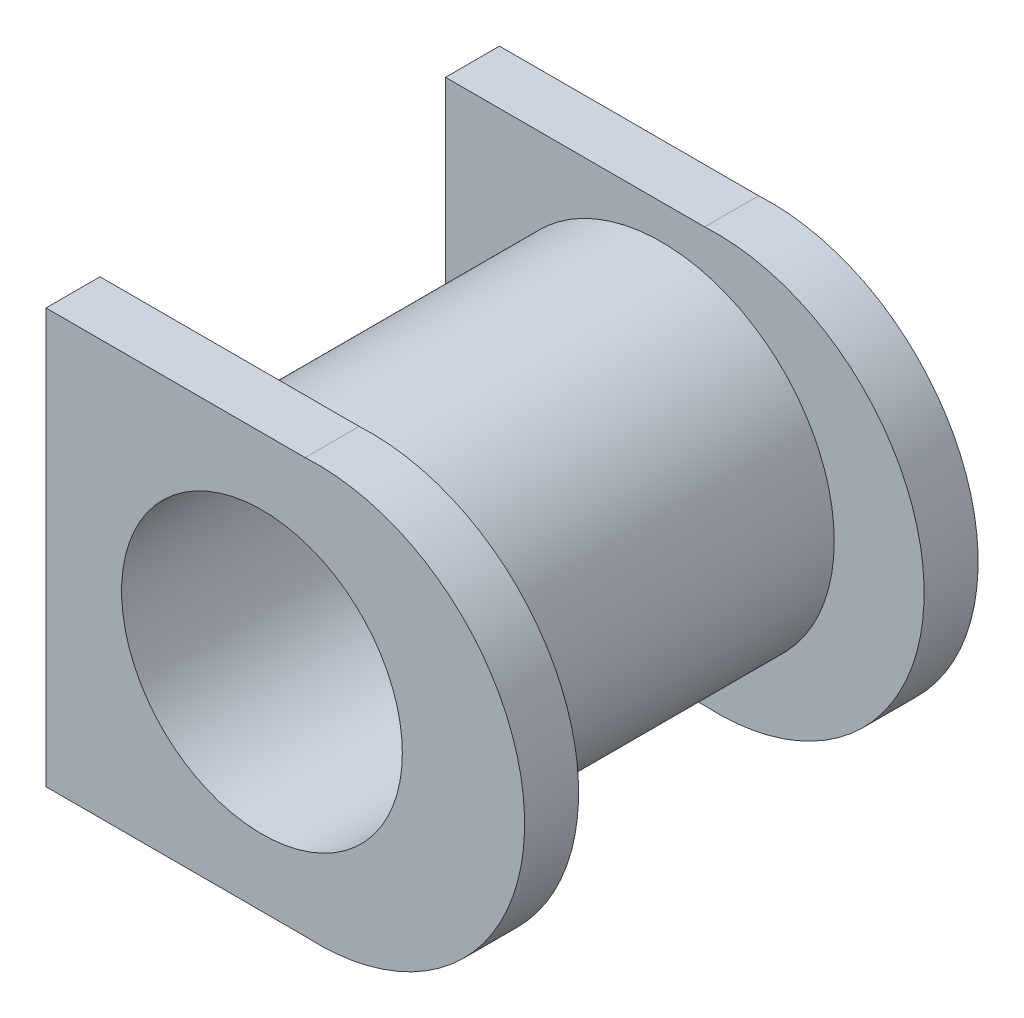
ISO-10303-21;
HEADER;
FILE_DESCRIPTION(('STEP AP214'),'2;1');
FILE_NAME('part.step','',(''),(''),'','','');
FILE_SCHEMA(('AUTOMOTIVE_DESIGN { 1 0 10303 214 1 1 1 1 }'));
ENDSEC;
DATA;
#1=APPLICATION_CONTEXT('core data for automotive mechanical design processes');
#2=APPLICATION_PROTOCOL_DEFINITION('international standard','automotive_design',2000,#1);
#3=PRODUCT_CONTEXT('',#1,'mechanical');
#4=PRODUCT('Part','Part','',(#3));
#5=PRODUCT_RELATED_PRODUCT_CATEGORY('part','',(#4));
#6=PRODUCT_DEFINITION_FORMATION('','',#4);
#7=PRODUCT_DEFINITION_CONTEXT('part definition',#1,'design');
#8=PRODUCT_DEFINITION('design','',#6,#7);
#9=PRODUCT_DEFINITION_SHAPE('','',#8);
#10=(LENGTH_UNIT() NAMED_UNIT(*) SI_UNIT(.MILLI.,.METRE.));
#11=(NAMED_UNIT(*) PLANE_ANGLE_UNIT() SI_UNIT($,.RADIAN.));
#12=(NAMED_UNIT(*) SI_UNIT($,.STERADIAN.) SOLID_ANGLE_UNIT());
#13=UNCERTAINTY_MEASURE_WITH_UNIT(LENGTH_MEASURE(1.E-05),#10,'distance_accuracy_value','');
#14=(GEOMETRIC_REPRESENTATION_CONTEXT(3) GLOBAL_UNCERTAINTY_ASSIGNED_CONTEXT((#13)) GLOBAL_UNIT_ASSIGNED_CONTEXT((#10,
#11,#12)) REPRESENTATION_CONTEXT('',''));
#15=CARTESIAN_POINT('',(0.,0.,0.));
#16=DIRECTION('',(0.,0.,1.));
#17=DIRECTION('',(1.,0.,0.));
#18=AXIS2_PLACEMENT_3D('',#15,#16,#17);
#19=CARTESIAN_POINT('',(32.7360823721547,0.,12.5));
#20=DIRECTION('',(0.,0.,-1.));
#21=DIRECTION('',(-1.,0.,0.));
#22=AXIS2_PLACEMENT_3D('',#19,#20,#21);
#23=CYLINDRICAL_SURFACE('',#22,48.0779174543492);
#24=CARTESIAN_POINT('',(32.7360823721547,0.,0.));
#25=DIRECTION('',(0.,0.,1.));
#26=DIRECTION('',(1.,0.,0.));
#27=AXIS2_PLACEMENT_3D('',#24,#25,#26);
#28=CIRCLE('',#27,48.0779174543492);
#29=CARTESIAN_POINT('',(30.,-48.,0.));
#30=VERTEX_POINT('',#29);
#31=CARTESIAN_POINT('',(30.,48.,0.));
#32=VERTEX_POINT('',#31);
#33=EDGE_CURVE('E149',#30,#32,#28,.T.);
#34=ORIENTED_EDGE('',*,*,#33,.T.);
#35=DIRECTION('',(0.,0.,-1.));
#36=VECTOR('',#35,1.);
#37=CARTESIAN_POINT('',(30.,48.,12.5));
#38=LINE('',#37,#36);
#39=CARTESIAN_POINT('',(30.,48.,12.5));
#40=VERTEX_POINT('',#39);
#41=EDGE_CURVE('E42',#40,#32,#38,.T.);
#42=ORIENTED_EDGE('',*,*,#41,.F.);
#43=CARTESIAN_POINT('',(32.7360823721547,0.,12.5));
#44=DIRECTION('',(0.,0.,1.));
#45=DIRECTION('',(1.,0.,0.));
#46=AXIS2_PLACEMENT_3D('',#43,#44,#45);
#47=CIRCLE('',#46,48.0779174543492);
#48=CARTESIAN_POINT('',(30.,-48.,12.5));
#49=VERTEX_POINT('',#48);
#50=EDGE_CURVE('E155',#49,#40,#47,.T.);
#51=ORIENTED_EDGE('',*,*,#50,.F.);
#52=DIRECTION('',(0.,0.,-1.));
#53=VECTOR('',#52,1.);
#54=CARTESIAN_POINT('',(30.,-48.,12.5));
#55=LINE('',#54,#53);
#56=EDGE_CURVE('E165',#49,#30,#55,.T.);
#57=ORIENTED_EDGE('',*,*,#56,.T.);
#58=EDGE_LOOP('',(#34,#42,#51,#57));
#59=FACE_BOUND('',#58,.T.);
#60=ADVANCED_FACE('F39',(#59),#23,.T.);
#61=CARTESIAN_POINT('',(-30.,48.,12.5));
#62=DIRECTION('',(0.,-1.,0.));
#63=DIRECTION('',(0.,0.,-1.));
#64=AXIS2_PLACEMENT_3D('',#61,#62,#63);
#65=PLANE('',#64);
#66=DIRECTION('',(-1.,0.,0.));
#67=VECTOR('',#66,1.);
#68=CARTESIAN_POINT('',(-30.,48.,0.));
#69=LINE('',#68,#67);
#70=CARTESIAN_POINT('',(-30.,48.,0.));
#71=VERTEX_POINT('',#70);
#72=EDGE_CURVE('E169',#32,#71,#69,.T.);
#73=ORIENTED_EDGE('',*,*,#72,.T.);
#74=DIRECTION('',(0.,0.,-1.));
#75=VECTOR('',#74,1.);
#76=CARTESIAN_POINT('',(-30.,48.,12.5));
#77=LINE('',#76,#75);
#78=CARTESIAN_POINT('',(-30.,48.,12.5));
#79=VERTEX_POINT('',#78);
#80=EDGE_CURVE('E180',#79,#71,#77,.T.);
#81=ORIENTED_EDGE('',*,*,#80,.F.);
#82=DIRECTION('',(-1.,0.,0.));
#83=VECTOR('',#82,1.);
#84=CARTESIAN_POINT('',(-30.,48.,12.5));
#85=LINE('',#84,#83);
#86=EDGE_CURVE('E89',#40,#79,#85,.T.);
#87=ORIENTED_EDGE('',*,*,#86,.F.);
#88=ORIENTED_EDGE('',*,*,#41,.T.);
#89=EDGE_LOOP('',(#73,#81,#87,#88));
#90=FACE_BOUND('',#89,.T.);
#91=ADVANCED_FACE('F185',(#90),#65,.F.);
#92=CARTESIAN_POINT('',(-30.,-48.,12.5));
#93=DIRECTION('',(1.,0.,0.));
#94=DIRECTION('',(0.,0.,-1.));
#95=AXIS2_PLACEMENT_3D('',#92,#93,#94);
#96=PLANE('',#95);
#97=DIRECTION('',(0.,-1.,0.));
#98=VECTOR('',#97,1.);
#99=CARTESIAN_POINT('',(-30.,-48.,0.));
#100=LINE('',#99,#98);
#101=CARTESIAN_POINT('',(-30.,-48.,0.));
#102=VERTEX_POINT('',#101);
#103=EDGE_CURVE('E75',#71,#102,#100,.T.);
#104=ORIENTED_EDGE('',*,*,#103,.T.);
#105=DIRECTION('',(0.,0.,-1.));
#106=VECTOR('',#105,1.);
#107=CARTESIAN_POINT('',(-30.,-48.,12.5));
#108=LINE('',#107,#106);
#109=CARTESIAN_POINT('',(-30.,-48.,12.5));
#110=VERTEX_POINT('',#109);
#111=EDGE_CURVE('E178',#110,#102,#108,.T.);
#112=ORIENTED_EDGE('',*,*,#111,.F.);
#113=DIRECTION('',(0.,-1.,0.));
#114=VECTOR('',#113,1.);
#115=CARTESIAN_POINT('',(-30.,-48.,12.5));
#116=LINE('',#115,#114);
#117=EDGE_CURVE('E160',#79,#110,#116,.T.);
#118=ORIENTED_EDGE('',*,*,#117,.F.);
#119=ORIENTED_EDGE('',*,*,#80,.T.);
#120=EDGE_LOOP('',(#104,#112,#118,#119));
#121=FACE_BOUND('',#120,.T.);
#122=ADVANCED_FACE('F211',(#121),#96,.F.);
#123=CARTESIAN_POINT('',(-30.,-48.,12.5));
#124=DIRECTION('',(0.,1.,0.));
#125=DIRECTION('',(0.,0.,1.));
#126=AXIS2_PLACEMENT_3D('',#123,#124,#125);
#127=PLANE('',#126);
#128=DIRECTION('',(1.,0.,0.));
#129=VECTOR('',#128,1.);
#130=CARTESIAN_POINT('',(-30.,-48.,0.));
#131=LINE('',#130,#129);
#132=EDGE_CURVE('E81',#102,#30,#131,.T.);
#133=ORIENTED_EDGE('',*,*,#132,.T.);
#134=ORIENTED_EDGE('',*,*,#56,.F.);
#135=DIRECTION('',(1.,0.,0.));
#136=VECTOR('',#135,1.);
#137=CARTESIAN_POINT('',(-30.,-48.,12.5));
#138=LINE('',#137,#136);
#139=EDGE_CURVE('E57',#110,#49,#138,.T.);
#140=ORIENTED_EDGE('',*,*,#139,.F.);
#141=ORIENTED_EDGE('',*,*,#111,.T.);
#142=EDGE_LOOP('',(#133,#134,#140,#141));
#143=FACE_BOUND('',#142,.T.);
#144=ADVANCED_FACE('F202',(#143),#127,.F.);
#145=CARTESIAN_POINT('',(32.7360823721547,0.,12.5));
#146=DIRECTION('',(0.,0.,1.));
#147=DIRECTION('',(1.,0.,0.));
#148=AXIS2_PLACEMENT_3D('',#145,#146,#147);
#149=PLANE('',#148);
#150=CARTESIAN_POINT('',(20.,0.,12.5));
#151=DIRECTION('',(0.,0.,1.));
#152=DIRECTION('',(1.,0.,0.));
#153=AXIS2_PLACEMENT_3D('',#150,#151,#152);
#154=CIRCLE('',#153,40.);
#155=CARTESIAN_POINT('',(60.,0.,12.5));
#156=VERTEX_POINT('',#155);
#157=EDGE_CURVE('E11',#156,#156,#154,.T.);
#158=ORIENTED_EDGE('',*,*,#157,.F.);
#159=EDGE_LOOP('',(#158));
#160=FACE_BOUND('',#159,.T.);
#161=ORIENTED_EDGE('',*,*,#50,.T.);
#162=ORIENTED_EDGE('',*,*,#86,.T.);
#163=ORIENTED_EDGE('',*,*,#117,.T.);
#164=ORIENTED_EDGE('',*,*,#139,.T.);
#165=EDGE_LOOP('',(#161,#162,#163,#164));
#166=FACE_BOUND('',#165,.T.);
#167=ADVANCED_FACE('F193',(#160,#166),#149,.T.);
#168=CARTESIAN_POINT('',(32.7360823721547,0.,0.));
#169=DIRECTION('',(0.,0.,1.));
#170=DIRECTION('',(1.,0.,0.));
#171=AXIS2_PLACEMENT_3D('',#168,#169,#170);
#172=PLANE('',#171);
#173=CARTESIAN_POINT('',(20.,0.,0.));
#174=DIRECTION('',(0.,0.,1.));
#175=DIRECTION('',(1.,0.,0.));
#176=AXIS2_PLACEMENT_3D('',#173,#174,#175);
#177=CIRCLE('',#176,32.5);
#178=CARTESIAN_POINT('',(52.5,0.,0.));
#179=VERTEX_POINT('',#178);
#180=EDGE_CURVE('E306',#179,#179,#177,.T.);
#181=ORIENTED_EDGE('',*,*,#180,.T.);
#182=EDGE_LOOP('',(#181));
#183=FACE_BOUND('',#182,.T.);
#184=ORIENTED_EDGE('',*,*,#33,.F.);
#185=ORIENTED_EDGE('',*,*,#132,.F.);
#186=ORIENTED_EDGE('',*,*,#103,.F.);
#187=ORIENTED_EDGE('',*,*,#72,.F.);
#188=EDGE_LOOP('',(#184,#185,#186,#187));
#189=FACE_BOUND('',#188,.T.);
#190=ADVANCED_FACE('F190',(#183,#189),#172,.F.);
#191=CARTESIAN_POINT('',(20.,0.,92.5));
#192=DIRECTION('',(0.,0.,-1.));
#193=DIRECTION('',(-1.,0.,0.));
#194=AXIS2_PLACEMENT_3D('',#191,#192,#193);
#195=CYLINDRICAL_SURFACE('',#194,40.);
#196=CARTESIAN_POINT('',(20.,0.,92.5));
#197=DIRECTION('',(0.,0.,1.));
#198=DIRECTION('',(1.,0.,0.));
#199=AXIS2_PLACEMENT_3D('',#196,#197,#198);
#200=CIRCLE('',#199,40.);
#201=CARTESIAN_POINT('',(60.,0.,92.5));
#202=VERTEX_POINT('',#201);
#203=EDGE_CURVE('E144',#202,#202,#200,.T.);
#204=ORIENTED_EDGE('',*,*,#203,.F.);
#205=EDGE_LOOP('',(#204));
#206=FACE_BOUND('',#205,.T.);
#207=ORIENTED_EDGE('',*,*,#157,.T.);
#208=EDGE_LOOP('',(#207));
#209=FACE_BOUND('',#208,.T.);
#210=ADVANCED_FACE('F192',(#206,#209),#195,.T.);
#211=CARTESIAN_POINT('',(-30.,48.,105.));
#212=DIRECTION('',(0.,-1.,0.));
#213=DIRECTION('',(0.,0.,-1.));
#214=AXIS2_PLACEMENT_3D('',#211,#212,#213);
#215=PLANE('',#214);
#216=DIRECTION('',(-1.,0.,0.));
#217=VECTOR('',#216,1.);
#218=CARTESIAN_POINT('',(-30.,48.,92.5));
#219=LINE('',#218,#217);
#220=CARTESIAN_POINT('',(30.,48.,92.5));
#221=VERTEX_POINT('',#220);
#222=CARTESIAN_POINT('',(-30.,48.,92.5));
#223=VERTEX_POINT('',#222);
#224=EDGE_CURVE('E142',#221,#223,#219,.T.);
#225=ORIENTED_EDGE('',*,*,#224,.T.);
#226=DIRECTION('',(0.,0.,-1.));
#227=VECTOR('',#226,1.);
#228=CARTESIAN_POINT('',(-30.,48.,105.));
#229=LINE('',#228,#227);
#230=CARTESIAN_POINT('',(-30.,48.,105.));
#231=VERTEX_POINT('',#230);
#232=EDGE_CURVE('E120',#231,#223,#229,.T.);
#233=ORIENTED_EDGE('',*,*,#232,.F.);
#234=DIRECTION('',(-1.,0.,0.));
#235=VECTOR('',#234,1.);
#236=CARTESIAN_POINT('',(-30.,48.,105.));
#237=LINE('',#236,#235);
#238=CARTESIAN_POINT('',(30.,48.,105.));
#239=VERTEX_POINT('',#238);
#240=EDGE_CURVE('E128',#239,#231,#237,.T.);
#241=ORIENTED_EDGE('',*,*,#240,.F.);
#242=DIRECTION('',(0.,0.,-1.));
#243=VECTOR('',#242,1.);
#244=CARTESIAN_POINT('',(30.,48.,105.));
#245=LINE('',#244,#243);
#246=EDGE_CURVE('E319',#239,#221,#245,.T.);
#247=ORIENTED_EDGE('',*,*,#246,.T.);
#248=EDGE_LOOP('',(#225,#233,#241,#247));
#249=FACE_BOUND('',#248,.T.);
#250=ADVANCED_FACE('F140',(#249),#215,.F.);
#251=CARTESIAN_POINT('',(-30.,48.,105.));
#252=DIRECTION('',(1.,0.,0.));
#253=DIRECTION('',(0.,0.,-1.));
#254=AXIS2_PLACEMENT_3D('',#251,#252,#253);
#255=PLANE('',#254);
#256=DIRECTION('',(0.,-1.,0.));
#257=VECTOR('',#256,1.);
#258=CARTESIAN_POINT('',(-30.,48.,92.5));
#259=LINE('',#258,#257);
#260=CARTESIAN_POINT('',(-30.,-48.,92.5));
#261=VERTEX_POINT('',#260);
#262=EDGE_CURVE('E322',#223,#261,#259,.T.);
#263=ORIENTED_EDGE('',*,*,#262,.T.);
#264=DIRECTION('',(0.,0.,-1.));
#265=VECTOR('',#264,1.);
#266=CARTESIAN_POINT('',(-30.,-48.,105.));
#267=LINE('',#266,#265);
#268=CARTESIAN_POINT('',(-30.,-48.,105.));
#269=VERTEX_POINT('',#268);
#270=EDGE_CURVE('E123',#269,#261,#267,.T.);
#271=ORIENTED_EDGE('',*,*,#270,.F.);
#272=DIRECTION('',(0.,-1.,0.));
#273=VECTOR('',#272,1.);
#274=CARTESIAN_POINT('',(-30.,48.,105.));
#275=LINE('',#274,#273);
#276=EDGE_CURVE('E116',#231,#269,#275,.T.);
#277=ORIENTED_EDGE('',*,*,#276,.F.);
#278=ORIENTED_EDGE('',*,*,#232,.T.);
#279=EDGE_LOOP('',(#263,#271,#277,#278));
#280=FACE_BOUND('',#279,.T.);
#281=ADVANCED_FACE('F118',(#280),#255,.F.);
#282=CARTESIAN_POINT('',(-30.,-48.,105.));
#283=DIRECTION('',(0.,1.,0.));
#284=DIRECTION('',(0.,0.,1.));
#285=AXIS2_PLACEMENT_3D('',#282,#283,#284);
#286=PLANE('',#285);
#287=DIRECTION('',(1.,0.,0.));
#288=VECTOR('',#287,1.);
#289=CARTESIAN_POINT('',(-30.,-48.,92.5));
#290=LINE('',#289,#288);
#291=CARTESIAN_POINT('',(30.,-48.,92.5));
#292=VERTEX_POINT('',#291);
#293=EDGE_CURVE('E325',#261,#292,#290,.T.);
#294=ORIENTED_EDGE('',*,*,#293,.T.);
#295=DIRECTION('',(0.,0.,-1.));
#296=VECTOR('',#295,1.);
#297=CARTESIAN_POINT('',(30.,-48.,105.));
#298=LINE('',#297,#296);
#299=CARTESIAN_POINT('',(30.,-48.,105.));
#300=VERTEX_POINT('',#299);
#301=EDGE_CURVE('E151',#300,#292,#298,.T.);
#302=ORIENTED_EDGE('',*,*,#301,.F.);
#303=DIRECTION('',(1.,0.,0.));
#304=VECTOR('',#303,1.);
#305=CARTESIAN_POINT('',(-30.,-48.,105.));
#306=LINE('',#305,#304);
#307=EDGE_CURVE('E127',#269,#300,#306,.T.);
#308=ORIENTED_EDGE('',*,*,#307,.F.);
#309=ORIENTED_EDGE('',*,*,#270,.T.);
#310=EDGE_LOOP('',(#294,#302,#308,#309));
#311=FACE_BOUND('',#310,.T.);
#312=ADVANCED_FACE('F249',(#311),#286,.F.);
#313=CARTESIAN_POINT('',(32.7360823721547,0.,105.));
#314=DIRECTION('',(0.,0.,-1.));
#315=DIRECTION('',(-1.,0.,0.));
#316=AXIS2_PLACEMENT_3D('',#313,#314,#315);
#317=CYLINDRICAL_SURFACE('',#316,48.0779174543492);
#318=CARTESIAN_POINT('',(32.7360823721547,0.,92.5));
#319=DIRECTION('',(0.,0.,1.));
#320=DIRECTION('',(-1.,0.,0.));
#321=AXIS2_PLACEMENT_3D('',#318,#319,#320);
#322=CIRCLE('',#321,48.0779174543492);
#323=EDGE_CURVE('E138',#292,#221,#322,.T.);
#324=ORIENTED_EDGE('',*,*,#323,.T.);
#325=ORIENTED_EDGE('',*,*,#246,.F.);
#326=CARTESIAN_POINT('',(32.7360823721547,0.,105.));
#327=DIRECTION('',(0.,0.,1.));
#328=DIRECTION('',(-1.,0.,0.));
#329=AXIS2_PLACEMENT_3D('',#326,#327,#328);
#330=CIRCLE('',#329,48.0779174543492);
#331=EDGE_CURVE('E133',#300,#239,#330,.T.);
#332=ORIENTED_EDGE('',*,*,#331,.F.);
#333=ORIENTED_EDGE('',*,*,#301,.T.);
#334=EDGE_LOOP('',(#324,#325,#332,#333));
#335=FACE_BOUND('',#334,.T.);
#336=ADVANCED_FACE('F258',(#335),#317,.T.);
#337=CARTESIAN_POINT('',(32.7360823721547,0.,105.));
#338=DIRECTION('',(0.,0.,-1.));
#339=DIRECTION('',(-1.,0.,0.));
#340=AXIS2_PLACEMENT_3D('',#337,#338,#339);
#341=PLANE('',#340);
#342=CARTESIAN_POINT('',(20.,0.,105.));
#343=DIRECTION('',(0.,0.,1.));
#344=DIRECTION('',(1.,0.,0.));
#345=AXIS2_PLACEMENT_3D('',#342,#343,#344);
#346=CIRCLE('',#345,32.5);
#347=CARTESIAN_POINT('',(52.5,0.,105.));
#348=VERTEX_POINT('',#347);
#349=EDGE_CURVE('E309',#348,#348,#346,.T.);
#350=ORIENTED_EDGE('',*,*,#349,.F.);
#351=EDGE_LOOP('',(#350));
#352=FACE_BOUND('',#351,.T.);
#353=ORIENTED_EDGE('',*,*,#240,.T.);
#354=ORIENTED_EDGE('',*,*,#276,.T.);
#355=ORIENTED_EDGE('',*,*,#307,.T.);
#356=ORIENTED_EDGE('',*,*,#331,.T.);
#357=EDGE_LOOP('',(#353,#354,#355,#356));
#358=FACE_BOUND('',#357,.T.);
#359=ADVANCED_FACE('F131',(#352,#358),#341,.F.);
#360=CARTESIAN_POINT('',(32.7360823721547,0.,92.5));
#361=DIRECTION('',(0.,0.,-1.));
#362=DIRECTION('',(-1.,0.,0.));
#363=AXIS2_PLACEMENT_3D('',#360,#361,#362);
#364=PLANE('',#363);
#365=ORIENTED_EDGE('',*,*,#203,.T.);
#366=EDGE_LOOP('',(#365));
#367=FACE_BOUND('',#366,.T.);
#368=ORIENTED_EDGE('',*,*,#224,.F.);
#369=ORIENTED_EDGE('',*,*,#323,.F.);
#370=ORIENTED_EDGE('',*,*,#293,.F.);
#371=ORIENTED_EDGE('',*,*,#262,.F.);
#372=EDGE_LOOP('',(#368,#369,#370,#371));
#373=FACE_BOUND('',#372,.T.);
#374=ADVANCED_FACE('F275',(#367,#373),#364,.T.);
#375=CARTESIAN_POINT('',(20.,0.,0.));
#376=DIRECTION('',(0.,0.,1.));
#377=DIRECTION('',(1.,0.,0.));
#378=AXIS2_PLACEMENT_3D('',#375,#376,#377);
#379=CYLINDRICAL_SURFACE('',#378,32.5);
#380=ORIENTED_EDGE('',*,*,#180,.F.);
#381=EDGE_LOOP('',(#380));
#382=FACE_BOUND('',#381,.T.);
#383=ORIENTED_EDGE('',*,*,#349,.T.);
#384=EDGE_LOOP('',(#383));
#385=FACE_BOUND('',#384,.T.);
#386=ADVANCED_FACE('F279',(#382,#385),#379,.F.);
#387=CLOSED_SHELL('',(#60,#91,#122,#144,#167,#190,#210,#250,#281,#312,#336,#359,#374,#386));
#388=MANIFOLD_SOLID_BREP('B2',#387);
#389=ADVANCED_BREP_SHAPE_REPRESENTATION('',(#18,#388),#14);
#390=SHAPE_DEFINITION_REPRESENTATION(#9,#389);
ENDSEC;
END-ISO-10303-21;
